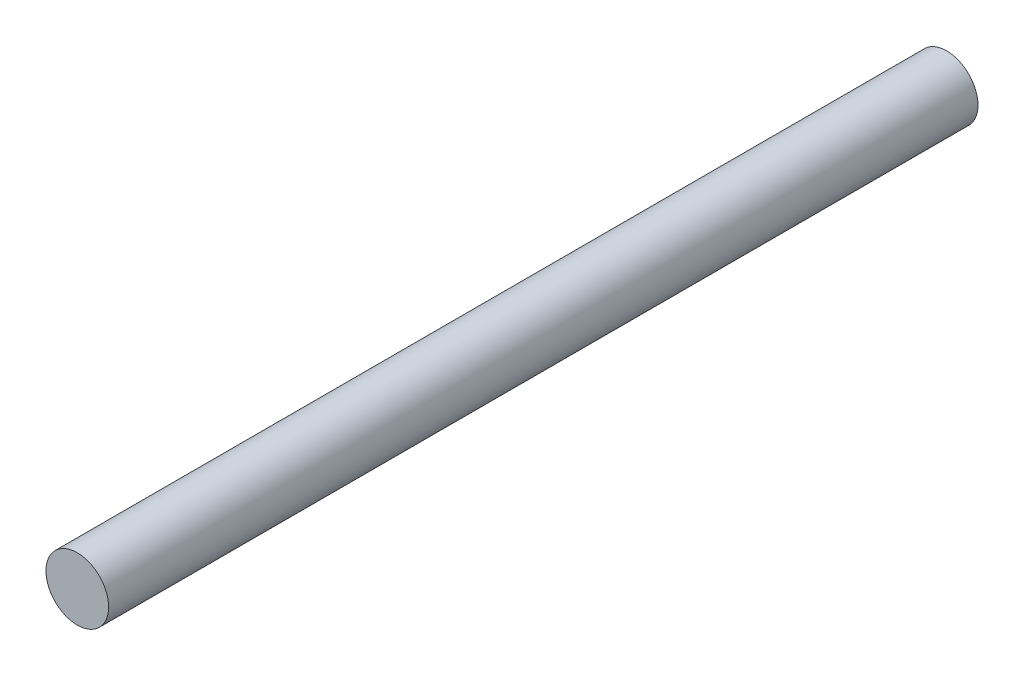
ISO-10303-21;
HEADER;
FILE_DESCRIPTION(('STEP AP214'),'2;1');
FILE_NAME('part.step','',(''),(''),'','','');
FILE_SCHEMA(('AUTOMOTIVE_DESIGN { 1 0 10303 214 1 1 1 1 }'));
ENDSEC;
DATA;
#1=APPLICATION_CONTEXT('core data for automotive mechanical design processes');
#2=APPLICATION_PROTOCOL_DEFINITION('international standard','automotive_design',2000,#1);
#3=PRODUCT_CONTEXT('',#1,'mechanical');
#4=PRODUCT('Part','Part','',(#3));
#5=PRODUCT_RELATED_PRODUCT_CATEGORY('part','',(#4));
#6=PRODUCT_DEFINITION_FORMATION('','',#4);
#7=PRODUCT_DEFINITION_CONTEXT('part definition',#1,'design');
#8=PRODUCT_DEFINITION('design','',#6,#7);
#9=PRODUCT_DEFINITION_SHAPE('','',#8);
#10=(LENGTH_UNIT() NAMED_UNIT(*) SI_UNIT(.MILLI.,.METRE.));
#11=(NAMED_UNIT(*) PLANE_ANGLE_UNIT() SI_UNIT($,.RADIAN.));
#12=(NAMED_UNIT(*) SI_UNIT($,.STERADIAN.) SOLID_ANGLE_UNIT());
#13=UNCERTAINTY_MEASURE_WITH_UNIT(LENGTH_MEASURE(1.E-05),#10,'distance_accuracy_value','');
#14=(GEOMETRIC_REPRESENTATION_CONTEXT(3) GLOBAL_UNCERTAINTY_ASSIGNED_CONTEXT((#13)) GLOBAL_UNIT_ASSIGNED_CONTEXT((#10,
#11,#12)) REPRESENTATION_CONTEXT('',''));
#15=CARTESIAN_POINT('',(0.,0.,0.));
#16=DIRECTION('',(0.,0.,1.));
#17=DIRECTION('',(1.,0.,0.));
#18=AXIS2_PLACEMENT_3D('',#15,#16,#17);
#19=CARTESIAN_POINT('',(0.,0.,132.08));
#20=DIRECTION('',(0.,0.,-1.));
#21=DIRECTION('',(-1.,0.,0.));
#22=AXIS2_PLACEMENT_3D('',#19,#20,#21);
#23=CYLINDRICAL_SURFACE('',#22,4.7625);
#24=CARTESIAN_POINT('',(0.,0.,132.08));
#25=DIRECTION('',(0.,0.,1.));
#26=DIRECTION('',(1.,0.,0.));
#27=AXIS2_PLACEMENT_3D('',#24,#25,#26);
#28=CIRCLE('',#27,4.7625);
#29=CARTESIAN_POINT('',(4.7625,0.,132.08));
#30=VERTEX_POINT('',#29);
#31=EDGE_CURVE('E10',#30,#30,#28,.T.);
#32=ORIENTED_EDGE('',*,*,#31,.F.);
#33=EDGE_LOOP('',(#32));
#34=FACE_BOUND('',#33,.T.);
#35=CARTESIAN_POINT('',(0.,0.,0.));
#36=DIRECTION('',(0.,0.,1.));
#37=DIRECTION('',(1.,0.,0.));
#38=AXIS2_PLACEMENT_3D('',#35,#36,#37);
#39=CIRCLE('',#38,4.7625);
#40=CARTESIAN_POINT('',(4.7625,0.,0.));
#41=VERTEX_POINT('',#40);
#42=EDGE_CURVE('E34',#41,#41,#39,.T.);
#43=ORIENTED_EDGE('',*,*,#42,.T.);
#44=EDGE_LOOP('',(#43));
#45=FACE_BOUND('',#44,.T.);
#46=ADVANCED_FACE('F31',(#34,#45),#23,.T.);
#47=CARTESIAN_POINT('',(0.,0.,132.08));
#48=DIRECTION('',(0.,0.,1.));
#49=DIRECTION('',(1.,0.,0.));
#50=AXIS2_PLACEMENT_3D('',#47,#48,#49);
#51=PLANE('',#50);
#52=ORIENTED_EDGE('',*,*,#31,.T.);
#53=EDGE_LOOP('',(#52));
#54=FACE_BOUND('',#53,.T.);
#55=ADVANCED_FACE('F46',(#54),#51,.T.);
#56=CARTESIAN_POINT('',(0.,0.,0.));
#57=DIRECTION('',(0.,0.,1.));
#58=DIRECTION('',(1.,0.,0.));
#59=AXIS2_PLACEMENT_3D('',#56,#57,#58);
#60=PLANE('',#59);
#61=ORIENTED_EDGE('',*,*,#42,.F.);
#62=EDGE_LOOP('',(#61));
#63=FACE_BOUND('',#62,.T.);
#64=ADVANCED_FACE('F44',(#63),#60,.F.);
#65=CLOSED_SHELL('',(#46,#55,#64));
#66=MANIFOLD_SOLID_BREP('B2',#65);
#67=ADVANCED_BREP_SHAPE_REPRESENTATION('',(#18,#66),#14);
#68=SHAPE_DEFINITION_REPRESENTATION(#9,#67);
ENDSEC;
END-ISO-10303-21;
